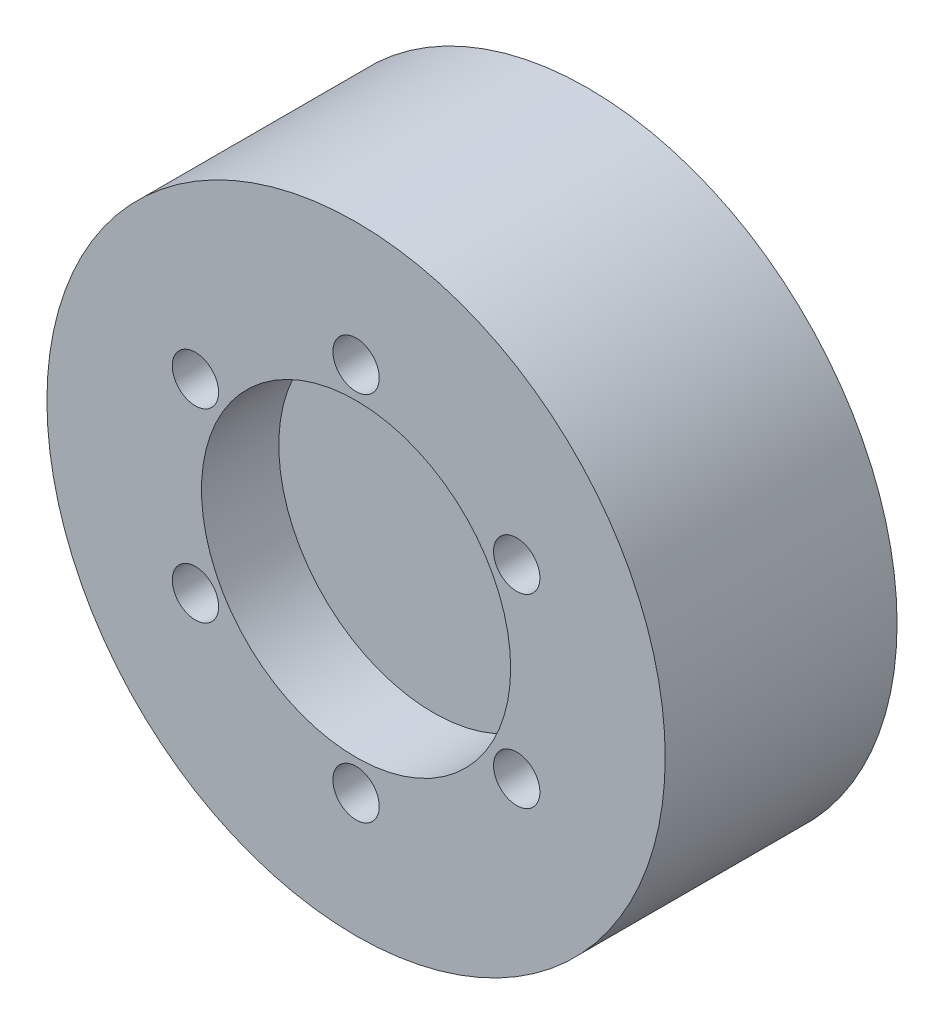
ISO-10303-21;
HEADER;
FILE_DESCRIPTION(('STEP AP214'),'2;1');
FILE_NAME('part.step','',(''),(''),'','','');
FILE_SCHEMA(('AUTOMOTIVE_DESIGN { 1 0 10303 214 1 1 1 1 }'));
ENDSEC;
DATA;
#1=APPLICATION_CONTEXT('core data for automotive mechanical design processes');
#2=APPLICATION_PROTOCOL_DEFINITION('international standard','automotive_design',2000,#1);
#3=PRODUCT_CONTEXT('',#1,'mechanical');
#4=PRODUCT('Part','Part','',(#3));
#5=PRODUCT_RELATED_PRODUCT_CATEGORY('part','',(#4));
#6=PRODUCT_DEFINITION_FORMATION('','',#4);
#7=PRODUCT_DEFINITION_CONTEXT('part definition',#1,'design');
#8=PRODUCT_DEFINITION('design','',#6,#7);
#9=PRODUCT_DEFINITION_SHAPE('','',#8);
#10=(LENGTH_UNIT() NAMED_UNIT(*) SI_UNIT(.MILLI.,.METRE.));
#11=(NAMED_UNIT(*) PLANE_ANGLE_UNIT() SI_UNIT($,.RADIAN.));
#12=(NAMED_UNIT(*) SI_UNIT($,.STERADIAN.) SOLID_ANGLE_UNIT());
#13=UNCERTAINTY_MEASURE_WITH_UNIT(LENGTH_MEASURE(1.E-05),#10,'distance_accuracy_value','');
#14=(GEOMETRIC_REPRESENTATION_CONTEXT(3) GLOBAL_UNCERTAINTY_ASSIGNED_CONTEXT((#13)) GLOBAL_UNIT_ASSIGNED_CONTEXT((#10,
#11,#12)) REPRESENTATION_CONTEXT('',''));
#15=CARTESIAN_POINT('',(0.,0.,0.));
#16=DIRECTION('',(0.,0.,1.));
#17=DIRECTION('',(1.,0.,0.));
#18=AXIS2_PLACEMENT_3D('',#15,#16,#17);
#19=CARTESIAN_POINT('',(0.,0.,15.));
#20=DIRECTION('',(0.,0.,-1.));
#21=DIRECTION('',(-1.,0.,0.));
#22=AXIS2_PLACEMENT_3D('',#19,#20,#21);
#23=CYLINDRICAL_SURFACE('',#22,20.);
#24=CARTESIAN_POINT('',(0.,0.,15.));
#25=DIRECTION('',(0.,0.,1.));
#26=DIRECTION('',(1.,0.,0.));
#27=AXIS2_PLACEMENT_3D('',#24,#25,#26);
#28=CIRCLE('',#27,20.);
#29=CARTESIAN_POINT('',(20.,0.,15.));
#30=VERTEX_POINT('',#29);
#31=EDGE_CURVE('E10',#30,#30,#28,.T.);
#32=ORIENTED_EDGE('',*,*,#31,.F.);
#33=EDGE_LOOP('',(#32));
#34=FACE_BOUND('',#33,.T.);
#35=CARTESIAN_POINT('',(0.,0.,0.));
#36=DIRECTION('',(0.,0.,1.));
#37=DIRECTION('',(1.,0.,0.));
#38=AXIS2_PLACEMENT_3D('',#35,#36,#37);
#39=CIRCLE('',#38,20.);
#40=CARTESIAN_POINT('',(20.,0.,0.));
#41=VERTEX_POINT('',#40);
#42=EDGE_CURVE('E35',#41,#41,#39,.T.);
#43=ORIENTED_EDGE('',*,*,#42,.T.);
#44=EDGE_LOOP('',(#43));
#45=FACE_BOUND('',#44,.T.);
#46=ADVANCED_FACE('F32',(#34,#45),#23,.T.);
#47=CARTESIAN_POINT('',(0.,0.,15.));
#48=DIRECTION('',(0.,0.,1.));
#49=DIRECTION('',(1.,0.,0.));
#50=AXIS2_PLACEMENT_3D('',#47,#48,#49);
#51=PLANE('',#50);
#52=CARTESIAN_POINT('',(0.,12.,15.));
#53=DIRECTION('',(0.,0.,1.));
#54=DIRECTION('',(1.,0.,0.));
#55=AXIS2_PLACEMENT_3D('',#52,#53,#54);
#56=CIRCLE('',#55,1.5);
#57=CARTESIAN_POINT('',(1.5,12.,15.));
#58=VERTEX_POINT('',#57);
#59=EDGE_CURVE('E81',#58,#58,#56,.T.);
#60=ORIENTED_EDGE('',*,*,#59,.F.);
#61=EDGE_LOOP('',(#60));
#62=FACE_BOUND('',#61,.T.);
#63=CARTESIAN_POINT('',(-10.3923048454131,5.9999999999997,15.));
#64=DIRECTION('',(0.,0.,1.));
#65=DIRECTION('',(1.,0.,0.));
#66=AXIS2_PLACEMENT_3D('',#63,#64,#65);
#67=CIRCLE('',#66,1.5);
#68=CARTESIAN_POINT('',(-8.8923048454131,5.9999999999997,15.));
#69=VERTEX_POINT('',#68);
#70=EDGE_CURVE('E82',#69,#69,#67,.T.);
#71=ORIENTED_EDGE('',*,*,#70,.F.);
#72=EDGE_LOOP('',(#71));
#73=FACE_BOUND('',#72,.T.);
#74=CARTESIAN_POINT('',(-10.3923048454128,-6.0000000000003,15.));
#75=DIRECTION('',(0.,0.,1.));
#76=DIRECTION('',(1.,0.,0.));
#77=AXIS2_PLACEMENT_3D('',#74,#75,#76);
#78=CIRCLE('',#77,1.5);
#79=CARTESIAN_POINT('',(-8.89230484541275,-6.0000000000003,15.));
#80=VERTEX_POINT('',#79);
#81=EDGE_CURVE('E56',#80,#80,#78,.T.);
#82=ORIENTED_EDGE('',*,*,#81,.F.);
#83=EDGE_LOOP('',(#82));
#84=FACE_BOUND('',#83,.T.);
#85=CARTESIAN_POINT('',(6.77712297852766E-13,-12.,15.));
#86=DIRECTION('',(0.,0.,1.));
#87=DIRECTION('',(1.,0.,0.));
#88=AXIS2_PLACEMENT_3D('',#85,#86,#87);
#89=CIRCLE('',#88,1.5);
#90=CARTESIAN_POINT('',(1.50000000000068,-12.,15.));
#91=VERTEX_POINT('',#90);
#92=EDGE_CURVE('E63',#91,#91,#89,.T.);
#93=ORIENTED_EDGE('',*,*,#92,.F.);
#94=EDGE_LOOP('',(#93));
#95=FACE_BOUND('',#94,.T.);
#96=CARTESIAN_POINT('',(10.3923048454138,-5.99999999999971,15.));
#97=DIRECTION('',(0.,0.,1.));
#98=DIRECTION('',(1.,0.,0.));
#99=AXIS2_PLACEMENT_3D('',#96,#97,#98);
#100=CIRCLE('',#99,1.5);
#101=CARTESIAN_POINT('',(11.8923048454138,-5.99999999999971,15.));
#102=VERTEX_POINT('',#101);
#103=EDGE_CURVE('E69',#102,#102,#100,.T.);
#104=ORIENTED_EDGE('',*,*,#103,.F.);
#105=EDGE_LOOP('',(#104));
#106=FACE_BOUND('',#105,.T.);
#107=CARTESIAN_POINT('',(10.3923048454134,6.0000000000003,15.));
#108=DIRECTION('',(0.,0.,1.));
#109=DIRECTION('',(1.,0.,0.));
#110=AXIS2_PLACEMENT_3D('',#107,#108,#109);
#111=CIRCLE('',#110,1.5);
#112=CARTESIAN_POINT('',(11.8923048454134,6.0000000000003,15.));
#113=VERTEX_POINT('',#112);
#114=EDGE_CURVE('E75',#113,#113,#111,.T.);
#115=ORIENTED_EDGE('',*,*,#114,.F.);
#116=EDGE_LOOP('',(#115));
#117=FACE_BOUND('',#116,.T.);
#118=CARTESIAN_POINT('',(0.,0.,15.));
#119=DIRECTION('',(0.,0.,1.));
#120=DIRECTION('',(1.,0.,0.));
#121=AXIS2_PLACEMENT_3D('',#118,#119,#120);
#122=CIRCLE('',#121,10.);
#123=CARTESIAN_POINT('',(10.,0.,15.));
#124=VERTEX_POINT('',#123);
#125=EDGE_CURVE('E44',#124,#124,#122,.T.);
#126=ORIENTED_EDGE('',*,*,#125,.F.);
#127=EDGE_LOOP('',(#126));
#128=FACE_BOUND('',#127,.T.);
#129=ORIENTED_EDGE('',*,*,#31,.T.);
#130=EDGE_LOOP('',(#129));
#131=FACE_BOUND('',#130,.T.);
#132=ADVANCED_FACE('F101',(#62,#73,#84,#95,#106,#117,#128,#131),#51,.T.);
#133=CARTESIAN_POINT('',(0.,0.,0.));
#134=DIRECTION('',(0.,0.,1.));
#135=DIRECTION('',(1.,0.,0.));
#136=AXIS2_PLACEMENT_3D('',#133,#134,#135);
#137=PLANE('',#136);
#138=CARTESIAN_POINT('',(0.,0.,0.));
#139=DIRECTION('',(0.,0.,-1.));
#140=DIRECTION('',(-1.,0.,0.));
#141=AXIS2_PLACEMENT_3D('',#138,#139,#140);
#142=CIRCLE('',#141,17.5);
#143=CARTESIAN_POINT('',(-17.5,0.,0.));
#144=VERTEX_POINT('',#143);
#145=EDGE_CURVE('E50',#144,#144,#142,.T.);
#146=ORIENTED_EDGE('',*,*,#145,.F.);
#147=EDGE_LOOP('',(#146));
#148=FACE_BOUND('',#147,.T.);
#149=ORIENTED_EDGE('',*,*,#42,.F.);
#150=EDGE_LOOP('',(#149));
#151=FACE_BOUND('',#150,.T.);
#152=ADVANCED_FACE('F104',(#148,#151),#137,.F.);
#153=CARTESIAN_POINT('',(0.,0.,10.));
#154=DIRECTION('',(0.,0.,1.));
#155=DIRECTION('',(1.,0.,0.));
#156=AXIS2_PLACEMENT_3D('',#153,#154,#155);
#157=CYLINDRICAL_SURFACE('',#156,10.);
#158=CARTESIAN_POINT('',(0.,0.,10.));
#159=DIRECTION('',(0.,0.,1.));
#160=DIRECTION('',(1.,0.,0.));
#161=AXIS2_PLACEMENT_3D('',#158,#159,#160);
#162=CIRCLE('',#161,10.);
#163=CARTESIAN_POINT('',(10.,0.,10.));
#164=VERTEX_POINT('',#163);
#165=EDGE_CURVE('E42',#164,#164,#162,.T.);
#166=ORIENTED_EDGE('',*,*,#165,.F.);
#167=EDGE_LOOP('',(#166));
#168=FACE_BOUND('',#167,.T.);
#169=ORIENTED_EDGE('',*,*,#125,.T.);
#170=EDGE_LOOP('',(#169));
#171=FACE_BOUND('',#170,.T.);
#172=ADVANCED_FACE('F118',(#168,#171),#157,.F.);
#173=CARTESIAN_POINT('',(0.,0.,10.));
#174=DIRECTION('',(0.,0.,1.));
#175=DIRECTION('',(1.,0.,0.));
#176=AXIS2_PLACEMENT_3D('',#173,#174,#175);
#177=PLANE('',#176);
#178=ORIENTED_EDGE('',*,*,#165,.T.);
#179=EDGE_LOOP('',(#178));
#180=FACE_BOUND('',#179,.T.);
#181=ADVANCED_FACE('F120',(#180),#177,.T.);
#182=CARTESIAN_POINT('',(0.,0.,3.));
#183=DIRECTION('',(0.,0.,-1.));
#184=DIRECTION('',(-1.,0.,0.));
#185=AXIS2_PLACEMENT_3D('',#182,#183,#184);
#186=CYLINDRICAL_SURFACE('',#185,17.5);
#187=CARTESIAN_POINT('',(0.,0.,3.));
#188=DIRECTION('',(0.,0.,-1.));
#189=DIRECTION('',(-1.,0.,0.));
#190=AXIS2_PLACEMENT_3D('',#187,#188,#189);
#191=CIRCLE('',#190,17.5);
#192=CARTESIAN_POINT('',(-17.5,0.,3.));
#193=VERTEX_POINT('',#192);
#194=EDGE_CURVE('E47',#193,#193,#191,.T.);
#195=ORIENTED_EDGE('',*,*,#194,.F.);
#196=EDGE_LOOP('',(#195));
#197=FACE_BOUND('',#196,.T.);
#198=ORIENTED_EDGE('',*,*,#145,.T.);
#199=EDGE_LOOP('',(#198));
#200=FACE_BOUND('',#199,.T.);
#201=ADVANCED_FACE('F127',(#197,#200),#186,.F.);
#202=CARTESIAN_POINT('',(0.,0.,3.));
#203=DIRECTION('',(0.,0.,-1.));
#204=DIRECTION('',(-1.,0.,0.));
#205=AXIS2_PLACEMENT_3D('',#202,#203,#204);
#206=PLANE('',#205);
#207=ORIENTED_EDGE('',*,*,#194,.T.);
#208=EDGE_LOOP('',(#207));
#209=FACE_BOUND('',#208,.T.);
#210=ADVANCED_FACE('F161',(#209),#206,.T.);
#211=CARTESIAN_POINT('',(10.3923048454134,6.0000000000003,10.));
#212=DIRECTION('',(0.,0.,1.));
#213=DIRECTION('',(1.,0.,0.));
#214=AXIS2_PLACEMENT_3D('',#211,#212,#213);
#215=CYLINDRICAL_SURFACE('',#214,1.5);
#216=CARTESIAN_POINT('',(10.3923048454134,6.0000000000003,10.));
#217=DIRECTION('',(0.,0.,1.));
#218=DIRECTION('',(1.,0.,0.));
#219=AXIS2_PLACEMENT_3D('',#216,#217,#218);
#220=CIRCLE('',#219,1.5);
#221=CARTESIAN_POINT('',(11.8923048454134,6.0000000000003,10.));
#222=VERTEX_POINT('',#221);
#223=EDGE_CURVE('E78',#222,#222,#220,.T.);
#224=ORIENTED_EDGE('',*,*,#223,.F.);
#225=EDGE_LOOP('',(#224));
#226=FACE_BOUND('',#225,.T.);
#227=ORIENTED_EDGE('',*,*,#114,.T.);
#228=EDGE_LOOP('',(#227));
#229=FACE_BOUND('',#228,.T.);
#230=ADVANCED_FACE('F170',(#226,#229),#215,.F.);
#231=CARTESIAN_POINT('',(10.3923048454134,6.0000000000003,10.));
#232=DIRECTION('',(0.,0.,1.));
#233=DIRECTION('',(1.,0.,0.));
#234=AXIS2_PLACEMENT_3D('',#231,#232,#233);
#235=PLANE('',#234);
#236=ORIENTED_EDGE('',*,*,#223,.T.);
#237=EDGE_LOOP('',(#236));
#238=FACE_BOUND('',#237,.T.);
#239=ADVANCED_FACE('F180',(#238),#235,.T.);
#240=CARTESIAN_POINT('',(10.3923048454138,-5.99999999999971,10.));
#241=DIRECTION('',(0.,0.,1.));
#242=DIRECTION('',(1.,0.,0.));
#243=AXIS2_PLACEMENT_3D('',#240,#241,#242);
#244=CYLINDRICAL_SURFACE('',#243,1.5);
#245=CARTESIAN_POINT('',(10.3923048454138,-5.99999999999971,10.));
#246=DIRECTION('',(0.,0.,1.));
#247=DIRECTION('',(1.,0.,0.));
#248=AXIS2_PLACEMENT_3D('',#245,#246,#247);
#249=CIRCLE('',#248,1.5);
#250=CARTESIAN_POINT('',(11.8923048454138,-5.99999999999971,10.));
#251=VERTEX_POINT('',#250);
#252=EDGE_CURVE('E72',#251,#251,#249,.T.);
#253=ORIENTED_EDGE('',*,*,#252,.F.);
#254=EDGE_LOOP('',(#253));
#255=FACE_BOUND('',#254,.T.);
#256=ORIENTED_EDGE('',*,*,#103,.T.);
#257=EDGE_LOOP('',(#256));
#258=FACE_BOUND('',#257,.T.);
#259=ADVANCED_FACE('F187',(#255,#258),#244,.F.);
#260=CARTESIAN_POINT('',(10.3923048454138,-5.99999999999971,10.));
#261=DIRECTION('',(0.,0.,1.));
#262=DIRECTION('',(1.,0.,0.));
#263=AXIS2_PLACEMENT_3D('',#260,#261,#262);
#264=PLANE('',#263);
#265=ORIENTED_EDGE('',*,*,#252,.T.);
#266=EDGE_LOOP('',(#265));
#267=FACE_BOUND('',#266,.T.);
#268=ADVANCED_FACE('F195',(#267),#264,.T.);
#269=CARTESIAN_POINT('',(6.77712297852766E-13,-12.,10.));
#270=DIRECTION('',(0.,0.,1.));
#271=DIRECTION('',(1.,0.,0.));
#272=AXIS2_PLACEMENT_3D('',#269,#270,#271);
#273=CYLINDRICAL_SURFACE('',#272,1.5);
#274=CARTESIAN_POINT('',(6.77712297852766E-13,-12.,10.));
#275=DIRECTION('',(0.,0.,1.));
#276=DIRECTION('',(1.,0.,0.));
#277=AXIS2_PLACEMENT_3D('',#274,#275,#276);
#278=CIRCLE('',#277,1.5);
#279=CARTESIAN_POINT('',(1.50000000000068,-12.,10.));
#280=VERTEX_POINT('',#279);
#281=EDGE_CURVE('E66',#280,#280,#278,.T.);
#282=ORIENTED_EDGE('',*,*,#281,.F.);
#283=EDGE_LOOP('',(#282));
#284=FACE_BOUND('',#283,.T.);
#285=ORIENTED_EDGE('',*,*,#92,.T.);
#286=EDGE_LOOP('',(#285));
#287=FACE_BOUND('',#286,.T.);
#288=ADVANCED_FACE('F203',(#284,#287),#273,.F.);
#289=CARTESIAN_POINT('',(6.77712297852766E-13,-12.,10.));
#290=DIRECTION('',(0.,0.,1.));
#291=DIRECTION('',(1.,0.,0.));
#292=AXIS2_PLACEMENT_3D('',#289,#290,#291);
#293=PLANE('',#292);
#294=ORIENTED_EDGE('',*,*,#281,.T.);
#295=EDGE_LOOP('',(#294));
#296=FACE_BOUND('',#295,.T.);
#297=ADVANCED_FACE('F211',(#296),#293,.T.);
#298=CARTESIAN_POINT('',(-10.3923048454128,-6.0000000000003,10.));
#299=DIRECTION('',(0.,0.,1.));
#300=DIRECTION('',(1.,0.,0.));
#301=AXIS2_PLACEMENT_3D('',#298,#299,#300);
#302=CYLINDRICAL_SURFACE('',#301,1.5);
#303=CARTESIAN_POINT('',(-10.3923048454128,-6.0000000000003,10.));
#304=DIRECTION('',(0.,0.,1.));
#305=DIRECTION('',(1.,0.,0.));
#306=AXIS2_PLACEMENT_3D('',#303,#304,#305);
#307=CIRCLE('',#306,1.5);
#308=CARTESIAN_POINT('',(-8.89230484541275,-6.0000000000003,10.));
#309=VERTEX_POINT('',#308);
#310=EDGE_CURVE('E59',#309,#309,#307,.T.);
#311=ORIENTED_EDGE('',*,*,#310,.F.);
#312=EDGE_LOOP('',(#311));
#313=FACE_BOUND('',#312,.T.);
#314=ORIENTED_EDGE('',*,*,#81,.T.);
#315=EDGE_LOOP('',(#314));
#316=FACE_BOUND('',#315,.T.);
#317=ADVANCED_FACE('F219',(#313,#316),#302,.F.);
#318=CARTESIAN_POINT('',(-10.3923048454128,-6.0000000000003,10.));
#319=DIRECTION('',(0.,0.,1.));
#320=DIRECTION('',(1.,0.,0.));
#321=AXIS2_PLACEMENT_3D('',#318,#319,#320);
#322=PLANE('',#321);
#323=ORIENTED_EDGE('',*,*,#310,.T.);
#324=EDGE_LOOP('',(#323));
#325=FACE_BOUND('',#324,.T.);
#326=ADVANCED_FACE('F227',(#325),#322,.T.);
#327=CARTESIAN_POINT('',(-10.3923048454131,5.9999999999997,10.));
#328=DIRECTION('',(0.,0.,1.));
#329=DIRECTION('',(1.,0.,0.));
#330=AXIS2_PLACEMENT_3D('',#327,#328,#329);
#331=CYLINDRICAL_SURFACE('',#330,1.5);
#332=CARTESIAN_POINT('',(-10.3923048454131,5.9999999999997,10.));
#333=DIRECTION('',(0.,0.,1.));
#334=DIRECTION('',(1.,0.,0.));
#335=AXIS2_PLACEMENT_3D('',#332,#333,#334);
#336=CIRCLE('',#335,1.5);
#337=CARTESIAN_POINT('',(-8.8923048454131,5.9999999999997,10.));
#338=VERTEX_POINT('',#337);
#339=EDGE_CURVE('E60',#338,#338,#336,.T.);
#340=ORIENTED_EDGE('',*,*,#339,.F.);
#341=EDGE_LOOP('',(#340));
#342=FACE_BOUND('',#341,.T.);
#343=ORIENTED_EDGE('',*,*,#70,.T.);
#344=EDGE_LOOP('',(#343));
#345=FACE_BOUND('',#344,.T.);
#346=ADVANCED_FACE('F235',(#342,#345),#331,.F.);
#347=CARTESIAN_POINT('',(-10.3923048454131,5.9999999999997,10.));
#348=DIRECTION('',(0.,0.,1.));
#349=DIRECTION('',(1.,0.,0.));
#350=AXIS2_PLACEMENT_3D('',#347,#348,#349);
#351=PLANE('',#350);
#352=ORIENTED_EDGE('',*,*,#339,.T.);
#353=EDGE_LOOP('',(#352));
#354=FACE_BOUND('',#353,.T.);
#355=ADVANCED_FACE('F97',(#354),#351,.T.);
#356=CARTESIAN_POINT('',(0.,12.,10.));
#357=DIRECTION('',(0.,0.,1.));
#358=DIRECTION('',(1.,0.,0.));
#359=AXIS2_PLACEMENT_3D('',#356,#357,#358);
#360=CYLINDRICAL_SURFACE('',#359,1.5);
#361=CARTESIAN_POINT('',(0.,12.,10.));
#362=DIRECTION('',(0.,0.,1.));
#363=DIRECTION('',(1.,0.,0.));
#364=AXIS2_PLACEMENT_3D('',#361,#362,#363);
#365=CIRCLE('',#364,1.5);
#366=CARTESIAN_POINT('',(1.5,12.,10.));
#367=VERTEX_POINT('',#366);
#368=EDGE_CURVE('E53',#367,#367,#365,.T.);
#369=ORIENTED_EDGE('',*,*,#368,.F.);
#370=EDGE_LOOP('',(#369));
#371=FACE_BOUND('',#370,.T.);
#372=ORIENTED_EDGE('',*,*,#59,.T.);
#373=EDGE_LOOP('',(#372));
#374=FACE_BOUND('',#373,.T.);
#375=ADVANCED_FACE('F94',(#371,#374),#360,.F.);
#376=CARTESIAN_POINT('',(0.,12.,10.));
#377=DIRECTION('',(0.,0.,1.));
#378=DIRECTION('',(1.,0.,0.));
#379=AXIS2_PLACEMENT_3D('',#376,#377,#378);
#380=PLANE('',#379);
#381=ORIENTED_EDGE('',*,*,#368,.T.);
#382=EDGE_LOOP('',(#381));
#383=FACE_BOUND('',#382,.T.);
#384=ADVANCED_FACE('F92',(#383),#380,.T.);
#385=CLOSED_SHELL('',(#46,#132,#152,#172,#181,#201,#210,#230,#239,#259,#268,#288,#297,#317,#326,
#346,#355,#375,#384));
#386=MANIFOLD_SOLID_BREP('B2',#385);
#387=ADVANCED_BREP_SHAPE_REPRESENTATION('',(#18,#386),#14);
#388=SHAPE_DEFINITION_REPRESENTATION(#9,#387);
ENDSEC;
END-ISO-10303-21;
